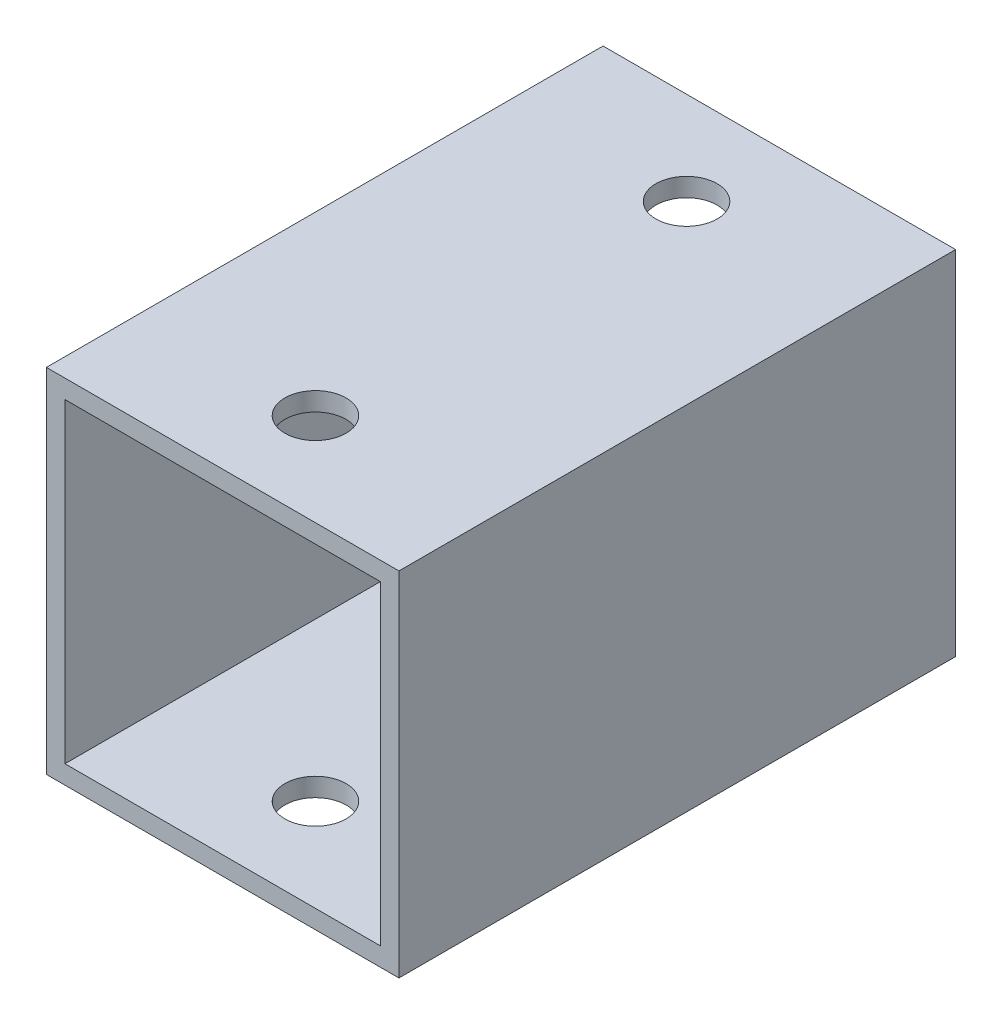
ISO-10303-21;
HEADER;
FILE_DESCRIPTION(('STEP AP214'),'2;1');
FILE_NAME('part.step','',(''),(''),'','','');
FILE_SCHEMA(('AUTOMOTIVE_DESIGN { 1 0 10303 214 1 1 1 1 }'));
ENDSEC;
DATA;
#1=APPLICATION_CONTEXT('core data for automotive mechanical design processes');
#2=APPLICATION_PROTOCOL_DEFINITION('international standard','automotive_design',2000,#1);
#3=PRODUCT_CONTEXT('',#1,'mechanical');
#4=PRODUCT('Part','Part','',(#3));
#5=PRODUCT_RELATED_PRODUCT_CATEGORY('part','',(#4));
#6=PRODUCT_DEFINITION_FORMATION('','',#4);
#7=PRODUCT_DEFINITION_CONTEXT('part definition',#1,'design');
#8=PRODUCT_DEFINITION('design','',#6,#7);
#9=PRODUCT_DEFINITION_SHAPE('','',#8);
#10=(LENGTH_UNIT() NAMED_UNIT(*) SI_UNIT(.MILLI.,.METRE.));
#11=(NAMED_UNIT(*) PLANE_ANGLE_UNIT() SI_UNIT($,.RADIAN.));
#12=(NAMED_UNIT(*) SI_UNIT($,.STERADIAN.) SOLID_ANGLE_UNIT());
#13=UNCERTAINTY_MEASURE_WITH_UNIT(LENGTH_MEASURE(1.E-05),#10,'distance_accuracy_value','');
#14=(GEOMETRIC_REPRESENTATION_CONTEXT(3) GLOBAL_UNCERTAINTY_ASSIGNED_CONTEXT((#13)) GLOBAL_UNIT_ASSIGNED_CONTEXT((#10,
#11,#12)) REPRESENTATION_CONTEXT('',''));
#15=CARTESIAN_POINT('',(0.,0.,0.));
#16=DIRECTION('',(0.,0.,1.));
#17=DIRECTION('',(1.,0.,0.));
#18=AXIS2_PLACEMENT_3D('',#15,#16,#17);
#19=CARTESIAN_POINT('',(0.,0.,30.));
#20=DIRECTION('',(0.,0.,-1.));
#21=DIRECTION('',(-1.,0.,0.));
#22=AXIS2_PLACEMENT_3D('',#19,#20,#21);
#23=PLANE('',#22);
#24=DIRECTION('',(0.,-1.,0.));
#25=VECTOR('',#24,1.);
#26=CARTESIAN_POINT('',(0.,0.,30.));
#27=LINE('',#26,#25);
#28=CARTESIAN_POINT('',(0.,19.,30.));
#29=VERTEX_POINT('',#28);
#30=CARTESIAN_POINT('',(0.,0.,30.));
#31=VERTEX_POINT('',#30);
#32=EDGE_CURVE('E133',#29,#31,#27,.T.);
#33=ORIENTED_EDGE('',*,*,#32,.T.);
#34=DIRECTION('',(1.,0.,0.));
#35=VECTOR('',#34,1.);
#36=CARTESIAN_POINT('',(0.,0.,30.));
#37=LINE('',#36,#35);
#38=CARTESIAN_POINT('',(19.,0.,30.));
#39=VERTEX_POINT('',#38);
#40=EDGE_CURVE('E136',#31,#39,#37,.T.);
#41=ORIENTED_EDGE('',*,*,#40,.T.);
#42=DIRECTION('',(0.,1.,0.));
#43=VECTOR('',#42,1.);
#44=CARTESIAN_POINT('',(19.,0.,30.));
#45=LINE('',#44,#43);
#46=CARTESIAN_POINT('',(19.,19.,30.));
#47=VERTEX_POINT('',#46);
#48=EDGE_CURVE('E139',#39,#47,#45,.T.);
#49=ORIENTED_EDGE('',*,*,#48,.T.);
#50=DIRECTION('',(-1.,0.,0.));
#51=VECTOR('',#50,1.);
#52=CARTESIAN_POINT('',(0.,19.,30.));
#53=LINE('',#52,#51);
#54=EDGE_CURVE('E141',#47,#29,#53,.T.);
#55=ORIENTED_EDGE('',*,*,#54,.T.);
#56=EDGE_LOOP('',(#33,#41,#49,#55));
#57=FACE_BOUND('',#56,.T.);
#58=DIRECTION('',(0.,-1.,0.));
#59=VECTOR('',#58,1.);
#60=CARTESIAN_POINT('',(1.,0.,30.));
#61=LINE('',#60,#59);
#62=CARTESIAN_POINT('',(1.,18.,30.));
#63=VERTEX_POINT('',#62);
#64=CARTESIAN_POINT('',(1.,1.,30.));
#65=VERTEX_POINT('',#64);
#66=EDGE_CURVE('E121',#63,#65,#61,.T.);
#67=ORIENTED_EDGE('',*,*,#66,.F.);
#68=DIRECTION('',(-1.,0.,0.));
#69=VECTOR('',#68,1.);
#70=CARTESIAN_POINT('',(0.,18.,30.));
#71=LINE('',#70,#69);
#72=CARTESIAN_POINT('',(18.,18.,30.));
#73=VERTEX_POINT('',#72);
#74=EDGE_CURVE('E105',#73,#63,#71,.T.);
#75=ORIENTED_EDGE('',*,*,#74,.F.);
#76=DIRECTION('',(0.,1.,0.));
#77=VECTOR('',#76,1.);
#78=CARTESIAN_POINT('',(18.,0.,30.));
#79=LINE('',#78,#77);
#80=CARTESIAN_POINT('',(18.,1.,30.));
#81=VERTEX_POINT('',#80);
#82=EDGE_CURVE('E130',#81,#73,#79,.T.);
#83=ORIENTED_EDGE('',*,*,#82,.F.);
#84=DIRECTION('',(1.,0.,0.));
#85=VECTOR('',#84,1.);
#86=CARTESIAN_POINT('',(0.,1.,30.));
#87=LINE('',#86,#85);
#88=EDGE_CURVE('E123',#65,#81,#87,.T.);
#89=ORIENTED_EDGE('',*,*,#88,.F.);
#90=EDGE_LOOP('',(#67,#75,#83,#89));
#91=FACE_BOUND('',#90,.T.);
#92=ADVANCED_FACE('F33',(#57,#91),#23,.F.);
#93=CARTESIAN_POINT('',(0.,0.,0.));
#94=DIRECTION('',(0.,0.,-1.));
#95=DIRECTION('',(-1.,0.,0.));
#96=AXIS2_PLACEMENT_3D('',#93,#94,#95);
#97=PLANE('',#96);
#98=DIRECTION('',(0.,-1.,0.));
#99=VECTOR('',#98,1.);
#100=CARTESIAN_POINT('',(0.,0.,0.));
#101=LINE('',#100,#99);
#102=CARTESIAN_POINT('',(0.,19.,0.));
#103=VERTEX_POINT('',#102);
#104=CARTESIAN_POINT('',(0.,0.,0.));
#105=VERTEX_POINT('',#104);
#106=EDGE_CURVE('E144',#103,#105,#101,.T.);
#107=ORIENTED_EDGE('',*,*,#106,.F.);
#108=DIRECTION('',(-1.,0.,0.));
#109=VECTOR('',#108,1.);
#110=CARTESIAN_POINT('',(0.,19.,0.));
#111=LINE('',#110,#109);
#112=CARTESIAN_POINT('',(19.,19.,0.));
#113=VERTEX_POINT('',#112);
#114=EDGE_CURVE('E137',#113,#103,#111,.T.);
#115=ORIENTED_EDGE('',*,*,#114,.F.);
#116=DIRECTION('',(0.,1.,0.));
#117=VECTOR('',#116,1.);
#118=CARTESIAN_POINT('',(19.,0.,0.));
#119=LINE('',#118,#117);
#120=CARTESIAN_POINT('',(19.,0.,0.));
#121=VERTEX_POINT('',#120);
#122=EDGE_CURVE('E149',#121,#113,#119,.T.);
#123=ORIENTED_EDGE('',*,*,#122,.F.);
#124=DIRECTION('',(1.,0.,0.));
#125=VECTOR('',#124,1.);
#126=CARTESIAN_POINT('',(0.,0.,0.));
#127=LINE('',#126,#125);
#128=EDGE_CURVE('E147',#105,#121,#127,.T.);
#129=ORIENTED_EDGE('',*,*,#128,.F.);
#130=EDGE_LOOP('',(#107,#115,#123,#129));
#131=FACE_BOUND('',#130,.T.);
#132=DIRECTION('',(-1.,0.,0.));
#133=VECTOR('',#132,1.);
#134=CARTESIAN_POINT('',(0.,18.,0.));
#135=LINE('',#134,#133);
#136=CARTESIAN_POINT('',(18.,18.,0.));
#137=VERTEX_POINT('',#136);
#138=CARTESIAN_POINT('',(1.,18.,0.));
#139=VERTEX_POINT('',#138);
#140=EDGE_CURVE('E103',#137,#139,#135,.T.);
#141=ORIENTED_EDGE('',*,*,#140,.T.);
#142=DIRECTION('',(0.,-1.,0.));
#143=VECTOR('',#142,1.);
#144=CARTESIAN_POINT('',(1.,0.,0.));
#145=LINE('',#144,#143);
#146=CARTESIAN_POINT('',(1.,1.,0.));
#147=VERTEX_POINT('',#146);
#148=EDGE_CURVE('E111',#139,#147,#145,.T.);
#149=ORIENTED_EDGE('',*,*,#148,.T.);
#150=DIRECTION('',(1.,0.,0.));
#151=VECTOR('',#150,1.);
#152=CARTESIAN_POINT('',(0.,1.,0.));
#153=LINE('',#152,#151);
#154=CARTESIAN_POINT('',(18.,1.,0.));
#155=VERTEX_POINT('',#154);
#156=EDGE_CURVE('E117',#147,#155,#153,.T.);
#157=ORIENTED_EDGE('',*,*,#156,.T.);
#158=DIRECTION('',(0.,1.,0.));
#159=VECTOR('',#158,1.);
#160=CARTESIAN_POINT('',(18.,0.,0.));
#161=LINE('',#160,#159);
#162=EDGE_CURVE('E57',#155,#137,#161,.T.);
#163=ORIENTED_EDGE('',*,*,#162,.T.);
#164=EDGE_LOOP('',(#141,#149,#157,#163));
#165=FACE_BOUND('',#164,.T.);
#166=ADVANCED_FACE('F120',(#131,#165),#97,.T.);
#167=CARTESIAN_POINT('',(0.,0.,30.));
#168=DIRECTION('',(1.,0.,0.));
#169=DIRECTION('',(0.,0.,-1.));
#170=AXIS2_PLACEMENT_3D('',#167,#168,#169);
#171=PLANE('',#170);
#172=ORIENTED_EDGE('',*,*,#106,.T.);
#173=DIRECTION('',(0.,0.,-1.));
#174=VECTOR('',#173,1.);
#175=CARTESIAN_POINT('',(0.,0.,30.));
#176=LINE('',#175,#174);
#177=EDGE_CURVE('E11',#31,#105,#176,.T.);
#178=ORIENTED_EDGE('',*,*,#177,.F.);
#179=ORIENTED_EDGE('',*,*,#32,.F.);
#180=DIRECTION('',(0.,0.,-1.));
#181=VECTOR('',#180,1.);
#182=CARTESIAN_POINT('',(0.,19.,30.));
#183=LINE('',#182,#181);
#184=EDGE_CURVE('E143',#29,#103,#183,.T.);
#185=ORIENTED_EDGE('',*,*,#184,.T.);
#186=EDGE_LOOP('',(#172,#178,#179,#185));
#187=FACE_BOUND('',#186,.T.);
#188=ADVANCED_FACE('F35',(#187),#171,.F.);
#189=CARTESIAN_POINT('',(0.,0.,30.));
#190=DIRECTION('',(0.,1.,0.));
#191=DIRECTION('',(0.,0.,1.));
#192=AXIS2_PLACEMENT_3D('',#189,#190,#191);
#193=PLANE('',#192);
#194=CARTESIAN_POINT('',(9.5,0.,5.));
#195=DIRECTION('',(0.,1.,0.));
#196=DIRECTION('',(0.,0.,1.));
#197=AXIS2_PLACEMENT_3D('',#194,#195,#196);
#198=CIRCLE('',#197,1.65);
#199=CARTESIAN_POINT('',(9.5,0.,6.65));
#200=VERTEX_POINT('',#199);
#201=EDGE_CURVE('E161',#200,#200,#198,.T.);
#202=ORIENTED_EDGE('',*,*,#201,.T.);
#203=EDGE_LOOP('',(#202));
#204=FACE_BOUND('',#203,.T.);
#205=CARTESIAN_POINT('',(9.5,0.,25.));
#206=DIRECTION('',(0.,1.,0.));
#207=DIRECTION('',(0.,0.,1.));
#208=AXIS2_PLACEMENT_3D('',#205,#206,#207);
#209=CIRCLE('',#208,1.65);
#210=CARTESIAN_POINT('',(9.5,0.,26.65));
#211=VERTEX_POINT('',#210);
#212=EDGE_CURVE('E177',#211,#211,#209,.T.);
#213=ORIENTED_EDGE('',*,*,#212,.T.);
#214=EDGE_LOOP('',(#213));
#215=FACE_BOUND('',#214,.T.);
#216=ORIENTED_EDGE('',*,*,#128,.T.);
#217=DIRECTION('',(0.,0.,-1.));
#218=VECTOR('',#217,1.);
#219=CARTESIAN_POINT('',(19.,0.,30.));
#220=LINE('',#219,#218);
#221=EDGE_CURVE('E42',#39,#121,#220,.T.);
#222=ORIENTED_EDGE('',*,*,#221,.F.);
#223=ORIENTED_EDGE('',*,*,#40,.F.);
#224=ORIENTED_EDGE('',*,*,#177,.T.);
#225=EDGE_LOOP('',(#216,#222,#223,#224));
#226=FACE_BOUND('',#225,.T.);
#227=ADVANCED_FACE('F217',(#204,#215,#226),#193,.F.);
#228=CARTESIAN_POINT('',(19.,0.,30.));
#229=DIRECTION('',(-1.,0.,0.));
#230=DIRECTION('',(0.,0.,1.));
#231=AXIS2_PLACEMENT_3D('',#228,#229,#230);
#232=PLANE('',#231);
#233=ORIENTED_EDGE('',*,*,#122,.T.);
#234=DIRECTION('',(0.,0.,-1.));
#235=VECTOR('',#234,1.);
#236=CARTESIAN_POINT('',(19.,19.,30.));
#237=LINE('',#236,#235);
#238=EDGE_CURVE('E154',#47,#113,#237,.T.);
#239=ORIENTED_EDGE('',*,*,#238,.F.);
#240=ORIENTED_EDGE('',*,*,#48,.F.);
#241=ORIENTED_EDGE('',*,*,#221,.T.);
#242=EDGE_LOOP('',(#233,#239,#240,#241));
#243=FACE_BOUND('',#242,.T.);
#244=ADVANCED_FACE('F214',(#243),#232,.F.);
#245=CARTESIAN_POINT('',(0.,19.,30.));
#246=DIRECTION('',(0.,-1.,0.));
#247=DIRECTION('',(0.,0.,-1.));
#248=AXIS2_PLACEMENT_3D('',#245,#246,#247);
#249=PLANE('',#248);
#250=CARTESIAN_POINT('',(9.5,19.,5.));
#251=DIRECTION('',(0.,1.,0.));
#252=DIRECTION('',(0.,0.,1.));
#253=AXIS2_PLACEMENT_3D('',#250,#251,#252);
#254=CIRCLE('',#253,1.65);
#255=CARTESIAN_POINT('',(9.5,19.,6.65));
#256=VERTEX_POINT('',#255);
#257=EDGE_CURVE('E167',#256,#256,#254,.T.);
#258=ORIENTED_EDGE('',*,*,#257,.F.);
#259=EDGE_LOOP('',(#258));
#260=FACE_BOUND('',#259,.T.);
#261=CARTESIAN_POINT('',(9.5,19.,25.));
#262=DIRECTION('',(0.,1.,0.));
#263=DIRECTION('',(0.,0.,1.));
#264=AXIS2_PLACEMENT_3D('',#261,#262,#263);
#265=CIRCLE('',#264,1.65);
#266=CARTESIAN_POINT('',(9.5,19.,26.65));
#267=VERTEX_POINT('',#266);
#268=EDGE_CURVE('E172',#267,#267,#265,.T.);
#269=ORIENTED_EDGE('',*,*,#268,.F.);
#270=EDGE_LOOP('',(#269));
#271=FACE_BOUND('',#270,.T.);
#272=ORIENTED_EDGE('',*,*,#114,.T.);
#273=ORIENTED_EDGE('',*,*,#184,.F.);
#274=ORIENTED_EDGE('',*,*,#54,.F.);
#275=ORIENTED_EDGE('',*,*,#238,.T.);
#276=EDGE_LOOP('',(#272,#273,#274,#275));
#277=FACE_BOUND('',#276,.T.);
#278=ADVANCED_FACE('F198',(#260,#271,#277),#249,.F.);
#279=CARTESIAN_POINT('',(1.,0.,30.));
#280=DIRECTION('',(1.,0.,0.));
#281=DIRECTION('',(0.,0.,-1.));
#282=AXIS2_PLACEMENT_3D('',#279,#280,#281);
#283=PLANE('',#282);
#284=ORIENTED_EDGE('',*,*,#148,.F.);
#285=DIRECTION('',(0.,0.,-1.));
#286=VECTOR('',#285,1.);
#287=CARTESIAN_POINT('',(1.,18.,30.));
#288=LINE('',#287,#286);
#289=EDGE_CURVE('E99',#63,#139,#288,.T.);
#290=ORIENTED_EDGE('',*,*,#289,.F.);
#291=ORIENTED_EDGE('',*,*,#66,.T.);
#292=DIRECTION('',(0.,0.,-1.));
#293=VECTOR('',#292,1.);
#294=CARTESIAN_POINT('',(1.,1.,30.));
#295=LINE('',#294,#293);
#296=EDGE_CURVE('E114',#65,#147,#295,.T.);
#297=ORIENTED_EDGE('',*,*,#296,.T.);
#298=EDGE_LOOP('',(#284,#290,#291,#297));
#299=FACE_BOUND('',#298,.T.);
#300=ADVANCED_FACE('F112',(#299),#283,.T.);
#301=CARTESIAN_POINT('',(0.,1.,30.));
#302=DIRECTION('',(0.,1.,0.));
#303=DIRECTION('',(0.,0.,1.));
#304=AXIS2_PLACEMENT_3D('',#301,#302,#303);
#305=PLANE('',#304);
#306=CARTESIAN_POINT('',(9.5,1.,5.));
#307=DIRECTION('',(0.,1.,0.));
#308=DIRECTION('',(0.,0.,1.));
#309=AXIS2_PLACEMENT_3D('',#306,#307,#308);
#310=CIRCLE('',#309,1.65);
#311=CARTESIAN_POINT('',(9.5,1.,6.65));
#312=VERTEX_POINT('',#311);
#313=EDGE_CURVE('E118',#312,#312,#310,.T.);
#314=ORIENTED_EDGE('',*,*,#313,.F.);
#315=EDGE_LOOP('',(#314));
#316=FACE_BOUND('',#315,.T.);
#317=CARTESIAN_POINT('',(9.5,1.,25.));
#318=DIRECTION('',(0.,1.,0.));
#319=DIRECTION('',(0.,0.,1.));
#320=AXIS2_PLACEMENT_3D('',#317,#318,#319);
#321=CIRCLE('',#320,1.65);
#322=CARTESIAN_POINT('',(9.5,1.,26.65));
#323=VERTEX_POINT('',#322);
#324=EDGE_CURVE('E160',#323,#323,#321,.T.);
#325=ORIENTED_EDGE('',*,*,#324,.F.);
#326=EDGE_LOOP('',(#325));
#327=FACE_BOUND('',#326,.T.);
#328=ORIENTED_EDGE('',*,*,#156,.F.);
#329=ORIENTED_EDGE('',*,*,#296,.F.);
#330=ORIENTED_EDGE('',*,*,#88,.T.);
#331=DIRECTION('',(0.,0.,-1.));
#332=VECTOR('',#331,1.);
#333=CARTESIAN_POINT('',(18.,1.,30.));
#334=LINE('',#333,#332);
#335=EDGE_CURVE('E182',#81,#155,#334,.T.);
#336=ORIENTED_EDGE('',*,*,#335,.T.);
#337=EDGE_LOOP('',(#328,#329,#330,#336));
#338=FACE_BOUND('',#337,.T.);
#339=ADVANCED_FACE('F189',(#316,#327,#338),#305,.T.);
#340=CARTESIAN_POINT('',(18.,0.,30.));
#341=DIRECTION('',(-1.,0.,0.));
#342=DIRECTION('',(0.,0.,1.));
#343=AXIS2_PLACEMENT_3D('',#340,#341,#342);
#344=PLANE('',#343);
#345=ORIENTED_EDGE('',*,*,#162,.F.);
#346=ORIENTED_EDGE('',*,*,#335,.F.);
#347=ORIENTED_EDGE('',*,*,#82,.T.);
#348=DIRECTION('',(0.,0.,-1.));
#349=VECTOR('',#348,1.);
#350=CARTESIAN_POINT('',(18.,18.,30.));
#351=LINE('',#350,#349);
#352=EDGE_CURVE('E50',#73,#137,#351,.T.);
#353=ORIENTED_EDGE('',*,*,#352,.T.);
#354=EDGE_LOOP('',(#345,#346,#347,#353));
#355=FACE_BOUND('',#354,.T.);
#356=ADVANCED_FACE('F184',(#355),#344,.T.);
#357=CARTESIAN_POINT('',(0.,18.,30.));
#358=DIRECTION('',(0.,-1.,0.));
#359=DIRECTION('',(0.,0.,-1.));
#360=AXIS2_PLACEMENT_3D('',#357,#358,#359);
#361=PLANE('',#360);
#362=CARTESIAN_POINT('',(9.5,18.,5.));
#363=DIRECTION('',(0.,-1.,0.));
#364=DIRECTION('',(0.,0.,-1.));
#365=AXIS2_PLACEMENT_3D('',#362,#363,#364);
#366=CIRCLE('',#365,1.65);
#367=CARTESIAN_POINT('',(9.5,18.,3.35));
#368=VERTEX_POINT('',#367);
#369=EDGE_CURVE('E37',#368,#368,#366,.T.);
#370=ORIENTED_EDGE('',*,*,#369,.F.);
#371=EDGE_LOOP('',(#370));
#372=FACE_BOUND('',#371,.T.);
#373=CARTESIAN_POINT('',(9.5,18.,25.));
#374=DIRECTION('',(0.,-1.,0.));
#375=DIRECTION('',(0.,0.,-1.));
#376=AXIS2_PLACEMENT_3D('',#373,#374,#375);
#377=CIRCLE('',#376,1.65);
#378=CARTESIAN_POINT('',(9.5,18.,23.35));
#379=VERTEX_POINT('',#378);
#380=EDGE_CURVE('E158',#379,#379,#377,.T.);
#381=ORIENTED_EDGE('',*,*,#380,.F.);
#382=EDGE_LOOP('',(#381));
#383=FACE_BOUND('',#382,.T.);
#384=ORIENTED_EDGE('',*,*,#140,.F.);
#385=ORIENTED_EDGE('',*,*,#352,.F.);
#386=ORIENTED_EDGE('',*,*,#74,.T.);
#387=ORIENTED_EDGE('',*,*,#289,.T.);
#388=EDGE_LOOP('',(#384,#385,#386,#387));
#389=FACE_BOUND('',#388,.T.);
#390=ADVANCED_FACE('F101',(#372,#383,#389),#361,.T.);
#391=CARTESIAN_POINT('',(9.5,0.,25.));
#392=DIRECTION('',(0.,1.,0.));
#393=DIRECTION('',(0.,0.,1.));
#394=AXIS2_PLACEMENT_3D('',#391,#392,#393);
#395=CYLINDRICAL_SURFACE('',#394,1.65);
#396=ORIENTED_EDGE('',*,*,#380,.T.);
#397=EDGE_LOOP('',(#396));
#398=FACE_BOUND('',#397,.T.);
#399=ORIENTED_EDGE('',*,*,#268,.T.);
#400=EDGE_LOOP('',(#399));
#401=FACE_BOUND('',#400,.T.);
#402=ADVANCED_FACE('F245',(#398,#401),#395,.F.);
#403=CARTESIAN_POINT('',(9.5,0.,5.));
#404=DIRECTION('',(0.,1.,0.));
#405=DIRECTION('',(0.,0.,1.));
#406=AXIS2_PLACEMENT_3D('',#403,#404,#405);
#407=CYLINDRICAL_SURFACE('',#406,1.65);
#408=ORIENTED_EDGE('',*,*,#369,.T.);
#409=EDGE_LOOP('',(#408));
#410=FACE_BOUND('',#409,.T.);
#411=ORIENTED_EDGE('',*,*,#257,.T.);
#412=EDGE_LOOP('',(#411));
#413=FACE_BOUND('',#412,.T.);
#414=ADVANCED_FACE('F242',(#410,#413),#407,.F.);
#415=ORIENTED_EDGE('',*,*,#324,.T.);
#416=EDGE_LOOP('',(#415));
#417=FACE_BOUND('',#416,.T.);
#418=ORIENTED_EDGE('',*,*,#212,.F.);
#419=EDGE_LOOP('',(#418));
#420=FACE_BOUND('',#419,.T.);
#421=ADVANCED_FACE('F239',(#417,#420),#395,.F.);
#422=ORIENTED_EDGE('',*,*,#313,.T.);
#423=EDGE_LOOP('',(#422));
#424=FACE_BOUND('',#423,.T.);
#425=ORIENTED_EDGE('',*,*,#201,.F.);
#426=EDGE_LOOP('',(#425));
#427=FACE_BOUND('',#426,.T.);
#428=ADVANCED_FACE('F241',(#424,#427),#407,.F.);
#429=CLOSED_SHELL('',(#92,#166,#188,#227,#244,#278,#300,#339,#356,#390,#402,#414,#421,#428));
#430=MANIFOLD_SOLID_BREP('B2',#429);
#431=ADVANCED_BREP_SHAPE_REPRESENTATION('',(#18,#430),#14);
#432=SHAPE_DEFINITION_REPRESENTATION(#9,#431);
ENDSEC;
END-ISO-10303-21;
